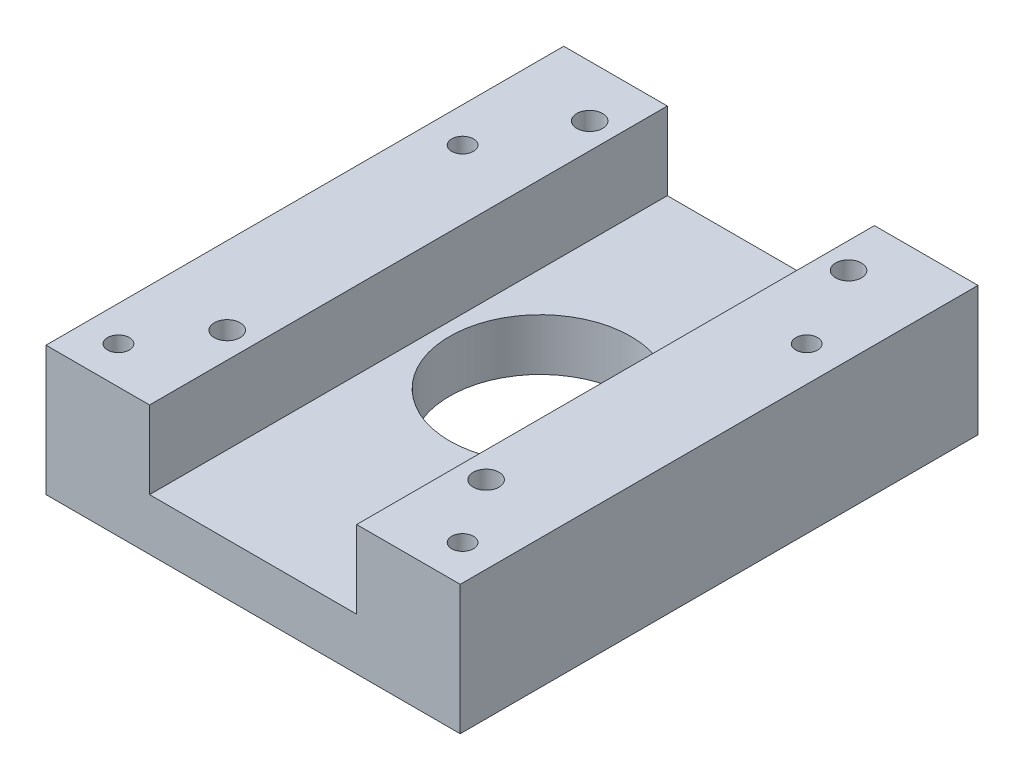
ISO-10303-21;
HEADER;
FILE_DESCRIPTION(('STEP AP214'),'2;1');
FILE_NAME('part.step','',(''),(''),'','','');
FILE_SCHEMA(('AUTOMOTIVE_DESIGN { 1 0 10303 214 1 1 1 1 }'));
ENDSEC;
DATA;
#1=APPLICATION_CONTEXT('core data for automotive mechanical design processes');
#2=APPLICATION_PROTOCOL_DEFINITION('international standard','automotive_design',2000,#1);
#3=PRODUCT_CONTEXT('',#1,'mechanical');
#4=PRODUCT('Part','Part','',(#3));
#5=PRODUCT_RELATED_PRODUCT_CATEGORY('part','',(#4));
#6=PRODUCT_DEFINITION_FORMATION('','',#4);
#7=PRODUCT_DEFINITION_CONTEXT('part definition',#1,'design');
#8=PRODUCT_DEFINITION('design','',#6,#7);
#9=PRODUCT_DEFINITION_SHAPE('','',#8);
#10=(LENGTH_UNIT() NAMED_UNIT(*) SI_UNIT(.MILLI.,.METRE.));
#11=(NAMED_UNIT(*) PLANE_ANGLE_UNIT() SI_UNIT($,.RADIAN.));
#12=(NAMED_UNIT(*) SI_UNIT($,.STERADIAN.) SOLID_ANGLE_UNIT());
#13=UNCERTAINTY_MEASURE_WITH_UNIT(LENGTH_MEASURE(1.E-05),#10,'distance_accuracy_value','');
#14=(GEOMETRIC_REPRESENTATION_CONTEXT(3) GLOBAL_UNCERTAINTY_ASSIGNED_CONTEXT((#13)) GLOBAL_UNIT_ASSIGNED_CONTEXT((#10,
#11,#12)) REPRESENTATION_CONTEXT('',''));
#15=CARTESIAN_POINT('',(0.,0.,0.));
#16=DIRECTION('',(0.,0.,1.));
#17=DIRECTION('',(1.,0.,0.));
#18=AXIS2_PLACEMENT_3D('',#15,#16,#17);
#19=CARTESIAN_POINT('',(0.,0.,80.));
#20=DIRECTION('',(0.,1.,0.));
#21=DIRECTION('',(0.,0.,1.));
#22=AXIS2_PLACEMENT_3D('',#19,#20,#21);
#23=PLANE('',#22);
#24=DIRECTION('',(0.,0.,-1.));
#25=VECTOR('',#24,1.);
#26=CARTESIAN_POINT('',(0.,0.,80.));
#27=LINE('',#26,#25);
#28=CARTESIAN_POINT('',(0.,0.,80.));
#29=VERTEX_POINT('',#28);
#30=CARTESIAN_POINT('',(0.,0.,-20.));
#31=VERTEX_POINT('',#30);
#32=EDGE_CURVE('E11',#29,#31,#27,.T.);
#33=ORIENTED_EDGE('',*,*,#32,.T.);
#34=DIRECTION('',(-1.,0.,0.));
#35=VECTOR('',#34,1.);
#36=CARTESIAN_POINT('',(0.,0.,-20.));
#37=LINE('',#36,#35);
#38=CARTESIAN_POINT('',(80.,0.,-20.));
#39=VERTEX_POINT('',#38);
#40=EDGE_CURVE('E103',#39,#31,#37,.T.);
#41=ORIENTED_EDGE('',*,*,#40,.F.);
#42=DIRECTION('',(0.,0.,-1.));
#43=VECTOR('',#42,1.);
#44=CARTESIAN_POINT('',(80.,0.,80.));
#45=LINE('',#44,#43);
#46=CARTESIAN_POINT('',(80.,0.,80.));
#47=VERTEX_POINT('',#46);
#48=EDGE_CURVE('E43',#47,#39,#45,.T.);
#49=ORIENTED_EDGE('',*,*,#48,.F.);
#50=DIRECTION('',(1.,0.,0.));
#51=VECTOR('',#50,1.);
#52=CARTESIAN_POINT('',(0.,0.,80.));
#53=LINE('',#52,#51);
#54=EDGE_CURVE('E104',#29,#47,#53,.T.);
#55=ORIENTED_EDGE('',*,*,#54,.F.);
#56=EDGE_LOOP('',(#33,#41,#49,#55));
#57=FACE_BOUND('',#56,.T.);
#58=CARTESIAN_POINT('',(73.2340187157678,0.,6.31104689627417));
#59=DIRECTION('',(0.,-1.,0.));
#60=DIRECTION('',(0.,0.,-1.));
#61=AXIS2_PLACEMENT_3D('',#58,#59,#60);
#62=CIRCLE('',#61,2.09999999999999);
#63=CARTESIAN_POINT('',(73.2340187157678,0.,4.21104689627418));
#64=VERTEX_POINT('',#63);
#65=EDGE_CURVE('E123',#64,#64,#62,.T.);
#66=ORIENTED_EDGE('',*,*,#65,.F.);
#67=EDGE_LOOP('',(#66));
#68=FACE_BOUND('',#67,.T.);
#69=CARTESIAN_POINT('',(6.76598128423225,0.,6.31104689627403));
#70=DIRECTION('',(0.,-1.,0.));
#71=DIRECTION('',(0.,0.,-1.));
#72=AXIS2_PLACEMENT_3D('',#69,#70,#71);
#73=CIRCLE('',#72,2.09999999999999);
#74=CARTESIAN_POINT('',(6.76598128423225,0.,4.21104689627405));
#75=VERTEX_POINT('',#74);
#76=EDGE_CURVE('E430',#75,#75,#73,.T.);
#77=ORIENTED_EDGE('',*,*,#76,.F.);
#78=EDGE_LOOP('',(#77));
#79=FACE_BOUND('',#78,.T.);
#80=CARTESIAN_POINT('',(6.76598128423234,0.,72.7790843278096));
#81=DIRECTION('',(0.,-1.,0.));
#82=DIRECTION('',(0.,0.,-1.));
#83=AXIS2_PLACEMENT_3D('',#80,#81,#82);
#84=CIRCLE('',#83,2.09999999999999);
#85=CARTESIAN_POINT('',(6.76598128423234,0.,70.6790843278096));
#86=VERTEX_POINT('',#85);
#87=EDGE_CURVE('E438',#86,#86,#84,.T.);
#88=ORIENTED_EDGE('',*,*,#87,.F.);
#89=EDGE_LOOP('',(#88));
#90=FACE_BOUND('',#89,.T.);
#91=CARTESIAN_POINT('',(73.2340187157679,0.,72.7790843278093));
#92=DIRECTION('',(0.,-1.,0.));
#93=DIRECTION('',(0.,0.,-1.));
#94=AXIS2_PLACEMENT_3D('',#91,#92,#93);
#95=CIRCLE('',#94,2.09999999999999);
#96=CARTESIAN_POINT('',(73.2340187157679,0.,70.6790843278093));
#97=VERTEX_POINT('',#96);
#98=EDGE_CURVE('E444',#97,#97,#95,.T.);
#99=ORIENTED_EDGE('',*,*,#98,.F.);
#100=EDGE_LOOP('',(#99));
#101=FACE_BOUND('',#100,.T.);
#102=CARTESIAN_POINT('',(65.,0.,60.));
#103=DIRECTION('',(0.,1.,0.));
#104=DIRECTION('',(0.,0.,1.));
#105=AXIS2_PLACEMENT_3D('',#102,#103,#104);
#106=CIRCLE('',#105,2.49999999999999);
#107=CARTESIAN_POINT('',(65.,0.,62.5));
#108=VERTEX_POINT('',#107);
#109=EDGE_CURVE('E447',#108,#108,#106,.T.);
#110=ORIENTED_EDGE('',*,*,#109,.T.);
#111=EDGE_LOOP('',(#110));
#112=FACE_BOUND('',#111,.T.);
#113=CARTESIAN_POINT('',(65.,0.,-10.));
#114=DIRECTION('',(0.,1.,0.));
#115=DIRECTION('',(0.,0.,1.));
#116=AXIS2_PLACEMENT_3D('',#113,#114,#115);
#117=CIRCLE('',#116,2.49999999999999);
#118=CARTESIAN_POINT('',(65.,0.,-7.50000000000002));
#119=VERTEX_POINT('',#118);
#120=EDGE_CURVE('E453',#119,#119,#117,.T.);
#121=ORIENTED_EDGE('',*,*,#120,.T.);
#122=EDGE_LOOP('',(#121));
#123=FACE_BOUND('',#122,.T.);
#124=CARTESIAN_POINT('',(15.,0.,60.));
#125=DIRECTION('',(0.,1.,0.));
#126=DIRECTION('',(0.,0.,1.));
#127=AXIS2_PLACEMENT_3D('',#124,#125,#126);
#128=CIRCLE('',#127,2.5);
#129=CARTESIAN_POINT('',(15.,0.,62.5));
#130=VERTEX_POINT('',#129);
#131=EDGE_CURVE('E459',#130,#130,#128,.T.);
#132=ORIENTED_EDGE('',*,*,#131,.T.);
#133=EDGE_LOOP('',(#132));
#134=FACE_BOUND('',#133,.T.);
#135=CARTESIAN_POINT('',(15.,0.,-10.));
#136=DIRECTION('',(0.,1.,0.));
#137=DIRECTION('',(0.,0.,1.));
#138=AXIS2_PLACEMENT_3D('',#135,#136,#137);
#139=CIRCLE('',#138,2.49999999999999);
#140=CARTESIAN_POINT('',(15.,0.,-7.50000000000002));
#141=VERTEX_POINT('',#140);
#142=EDGE_CURVE('E465',#141,#141,#139,.T.);
#143=ORIENTED_EDGE('',*,*,#142,.T.);
#144=EDGE_LOOP('',(#143));
#145=FACE_BOUND('',#144,.T.);
#146=CARTESIAN_POINT('',(39.9999999999998,0.,24.55));
#147=DIRECTION('',(0.,1.,0.));
#148=DIRECTION('',(0.,0.,1.));
#149=AXIS2_PLACEMENT_3D('',#146,#147,#148);
#150=CIRCLE('',#149,17.5);
#151=CARTESIAN_POINT('',(39.9999999999998,0.,7.05000000000003));
#152=VERTEX_POINT('',#151);
#153=EDGE_CURVE('E471',#152,#152,#150,.T.);
#154=ORIENTED_EDGE('',*,*,#153,.T.);
#155=EDGE_LOOP('',(#154));
#156=FACE_BOUND('',#155,.T.);
#157=ADVANCED_FACE('F34',(#57,#68,#79,#90,#101,#112,#123,#134,#145,#156),#23,.F.);
#158=CARTESIAN_POINT('',(60.,10.,80.));
#159=DIRECTION('',(0.,-1.,0.));
#160=DIRECTION('',(0.,0.,-1.));
#161=AXIS2_PLACEMENT_3D('',#158,#159,#160);
#162=PLANE('',#161);
#163=DIRECTION('',(0.,0.,-1.));
#164=VECTOR('',#163,1.);
#165=CARTESIAN_POINT('',(60.,10.,80.));
#166=LINE('',#165,#164);
#167=CARTESIAN_POINT('',(60.,10.,80.));
#168=VERTEX_POINT('',#167);
#169=CARTESIAN_POINT('',(60.,10.,-20.));
#170=VERTEX_POINT('',#169);
#171=EDGE_CURVE('E158',#168,#170,#166,.T.);
#172=ORIENTED_EDGE('',*,*,#171,.T.);
#173=DIRECTION('',(1.,0.,0.));
#174=VECTOR('',#173,1.);
#175=CARTESIAN_POINT('',(60.,10.,-20.));
#176=LINE('',#175,#174);
#177=CARTESIAN_POINT('',(20.,10.,-20.));
#178=VERTEX_POINT('',#177);
#179=EDGE_CURVE('E131',#178,#170,#176,.T.);
#180=ORIENTED_EDGE('',*,*,#179,.F.);
#181=DIRECTION('',(0.,0.,-1.));
#182=VECTOR('',#181,1.);
#183=CARTESIAN_POINT('',(20.,10.,80.));
#184=LINE('',#183,#182);
#185=CARTESIAN_POINT('',(20.,10.,80.));
#186=VERTEX_POINT('',#185);
#187=EDGE_CURVE('E156',#186,#178,#184,.T.);
#188=ORIENTED_EDGE('',*,*,#187,.F.);
#189=DIRECTION('',(-1.,0.,0.));
#190=VECTOR('',#189,1.);
#191=CARTESIAN_POINT('',(60.,10.,80.));
#192=LINE('',#191,#190);
#193=EDGE_CURVE('E149',#168,#186,#192,.T.);
#194=ORIENTED_EDGE('',*,*,#193,.F.);
#195=EDGE_LOOP('',(#172,#180,#188,#194));
#196=FACE_BOUND('',#195,.T.);
#197=CARTESIAN_POINT('',(39.9999999999998,10.,24.55));
#198=DIRECTION('',(0.,-1.,0.));
#199=DIRECTION('',(0.,0.,-1.));
#200=AXIS2_PLACEMENT_3D('',#197,#198,#199);
#201=CIRCLE('',#200,17.5);
#202=CARTESIAN_POINT('',(39.9999999999998,10.,7.05000000000003));
#203=VERTEX_POINT('',#202);
#204=EDGE_CURVE('E38',#203,#203,#201,.F.);
#205=ORIENTED_EDGE('',*,*,#204,.F.);
#206=EDGE_LOOP('',(#205));
#207=FACE_BOUND('',#206,.T.);
#208=ADVANCED_FACE('F183',(#196,#207),#162,.F.);
#209=CARTESIAN_POINT('',(0.,25.,80.));
#210=DIRECTION('',(1.,0.,0.));
#211=DIRECTION('',(0.,0.,-1.));
#212=AXIS2_PLACEMENT_3D('',#209,#210,#211);
#213=PLANE('',#212);
#214=DIRECTION('',(0.,0.,-1.));
#215=VECTOR('',#214,1.);
#216=CARTESIAN_POINT('',(0.,25.,80.));
#217=LINE('',#216,#215);
#218=CARTESIAN_POINT('',(0.,25.,80.));
#219=VERTEX_POINT('',#218);
#220=CARTESIAN_POINT('',(0.,25.,-20.));
#221=VERTEX_POINT('',#220);
#222=EDGE_CURVE('E109',#219,#221,#217,.T.);
#223=ORIENTED_EDGE('',*,*,#222,.T.);
#224=DIRECTION('',(0.,1.,0.));
#225=VECTOR('',#224,1.);
#226=CARTESIAN_POINT('',(0.,25.,-20.));
#227=LINE('',#226,#225);
#228=EDGE_CURVE('E108',#31,#221,#227,.T.);
#229=ORIENTED_EDGE('',*,*,#228,.F.);
#230=ORIENTED_EDGE('',*,*,#32,.F.);
#231=DIRECTION('',(0.,-1.,0.));
#232=VECTOR('',#231,1.);
#233=CARTESIAN_POINT('',(0.,25.,80.));
#234=LINE('',#233,#232);
#235=EDGE_CURVE('E140',#219,#29,#234,.T.);
#236=ORIENTED_EDGE('',*,*,#235,.F.);
#237=EDGE_LOOP('',(#223,#229,#230,#236));
#238=FACE_BOUND('',#237,.T.);
#239=ADVANCED_FACE('F36',(#238),#213,.F.);
#240=CARTESIAN_POINT('',(80.,0.,80.));
#241=DIRECTION('',(-1.,0.,0.));
#242=DIRECTION('',(0.,0.,1.));
#243=AXIS2_PLACEMENT_3D('',#240,#241,#242);
#244=PLANE('',#243);
#245=ORIENTED_EDGE('',*,*,#48,.T.);
#246=DIRECTION('',(0.,-1.,0.));
#247=VECTOR('',#246,1.);
#248=CARTESIAN_POINT('',(80.,0.,-20.));
#249=LINE('',#248,#247);
#250=CARTESIAN_POINT('',(80.,25.,-20.));
#251=VERTEX_POINT('',#250);
#252=EDGE_CURVE('E119',#251,#39,#249,.T.);
#253=ORIENTED_EDGE('',*,*,#252,.F.);
#254=DIRECTION('',(0.,0.,-1.));
#255=VECTOR('',#254,1.);
#256=CARTESIAN_POINT('',(80.,25.,80.));
#257=LINE('',#256,#255);
#258=CARTESIAN_POINT('',(80.,25.,80.));
#259=VERTEX_POINT('',#258);
#260=EDGE_CURVE('E162',#259,#251,#257,.T.);
#261=ORIENTED_EDGE('',*,*,#260,.F.);
#262=DIRECTION('',(0.,1.,0.));
#263=VECTOR('',#262,1.);
#264=CARTESIAN_POINT('',(80.,0.,80.));
#265=LINE('',#264,#263);
#266=EDGE_CURVE('E143',#47,#259,#265,.T.);
#267=ORIENTED_EDGE('',*,*,#266,.F.);
#268=EDGE_LOOP('',(#245,#253,#261,#267));
#269=FACE_BOUND('',#268,.T.);
#270=ADVANCED_FACE('F166',(#269),#244,.F.);
#271=CARTESIAN_POINT('',(80.,25.,80.));
#272=DIRECTION('',(0.,-1.,0.));
#273=DIRECTION('',(0.,0.,-1.));
#274=AXIS2_PLACEMENT_3D('',#271,#272,#273);
#275=PLANE('',#274);
#276=CARTESIAN_POINT('',(65.,25.,-10.));
#277=DIRECTION('',(0.,1.,0.));
#278=DIRECTION('',(0.,0.,1.));
#279=AXIS2_PLACEMENT_3D('',#276,#277,#278);
#280=CIRCLE('',#279,2.49999999999999);
#281=CARTESIAN_POINT('',(65.,25.,-7.50000000000002));
#282=VERTEX_POINT('',#281);
#283=EDGE_CURVE('E456',#282,#282,#280,.T.);
#284=ORIENTED_EDGE('',*,*,#283,.F.);
#285=EDGE_LOOP('',(#284));
#286=FACE_BOUND('',#285,.T.);
#287=CARTESIAN_POINT('',(65.,25.,60.));
#288=DIRECTION('',(0.,1.,0.));
#289=DIRECTION('',(0.,0.,1.));
#290=AXIS2_PLACEMENT_3D('',#287,#288,#289);
#291=CIRCLE('',#290,2.49999999999999);
#292=CARTESIAN_POINT('',(65.,25.,62.5));
#293=VERTEX_POINT('',#292);
#294=EDGE_CURVE('E450',#293,#293,#291,.T.);
#295=ORIENTED_EDGE('',*,*,#294,.F.);
#296=EDGE_LOOP('',(#295));
#297=FACE_BOUND('',#296,.T.);
#298=CARTESIAN_POINT('',(73.2340187157679,25.,72.7790843278093));
#299=DIRECTION('',(0.,-1.,0.));
#300=DIRECTION('',(0.,0.,-1.));
#301=AXIS2_PLACEMENT_3D('',#298,#299,#300);
#302=CIRCLE('',#301,2.09999999999999);
#303=CARTESIAN_POINT('',(73.2340187157679,25.,70.6790843278093));
#304=VERTEX_POINT('',#303);
#305=EDGE_CURVE('E441',#304,#304,#302,.T.);
#306=ORIENTED_EDGE('',*,*,#305,.T.);
#307=EDGE_LOOP('',(#306));
#308=FACE_BOUND('',#307,.T.);
#309=CARTESIAN_POINT('',(73.2340187157678,25.,6.31104689627417));
#310=DIRECTION('',(0.,-1.,0.));
#311=DIRECTION('',(0.,0.,-1.));
#312=AXIS2_PLACEMENT_3D('',#309,#310,#311);
#313=CIRCLE('',#312,2.09999999999999);
#314=CARTESIAN_POINT('',(73.2340187157678,25.,4.21104689627418));
#315=VERTEX_POINT('',#314);
#316=EDGE_CURVE('E120',#315,#315,#313,.T.);
#317=ORIENTED_EDGE('',*,*,#316,.T.);
#318=EDGE_LOOP('',(#317));
#319=FACE_BOUND('',#318,.T.);
#320=ORIENTED_EDGE('',*,*,#260,.T.);
#321=DIRECTION('',(1.,0.,0.));
#322=VECTOR('',#321,1.);
#323=CARTESIAN_POINT('',(80.,25.,-20.));
#324=LINE('',#323,#322);
#325=CARTESIAN_POINT('',(60.,25.,-20.));
#326=VERTEX_POINT('',#325);
#327=EDGE_CURVE('E137',#326,#251,#324,.T.);
#328=ORIENTED_EDGE('',*,*,#327,.F.);
#329=DIRECTION('',(0.,0.,-1.));
#330=VECTOR('',#329,1.);
#331=CARTESIAN_POINT('',(60.,25.,80.));
#332=LINE('',#331,#330);
#333=CARTESIAN_POINT('',(60.,25.,80.));
#334=VERTEX_POINT('',#333);
#335=EDGE_CURVE('E160',#334,#326,#332,.T.);
#336=ORIENTED_EDGE('',*,*,#335,.F.);
#337=DIRECTION('',(-1.,0.,0.));
#338=VECTOR('',#337,1.);
#339=CARTESIAN_POINT('',(80.,25.,80.));
#340=LINE('',#339,#338);
#341=EDGE_CURVE('E145',#259,#334,#340,.T.);
#342=ORIENTED_EDGE('',*,*,#341,.F.);
#343=EDGE_LOOP('',(#320,#328,#336,#342));
#344=FACE_BOUND('',#343,.T.);
#345=ADVANCED_FACE('F175',(#286,#297,#308,#319,#344),#275,.F.);
#346=CARTESIAN_POINT('',(60.,25.,80.));
#347=DIRECTION('',(1.,0.,0.));
#348=DIRECTION('',(0.,1.,0.));
#349=AXIS2_PLACEMENT_3D('',#346,#347,#348);
#350=PLANE('',#349);
#351=ORIENTED_EDGE('',*,*,#335,.T.);
#352=DIRECTION('',(0.,1.,0.));
#353=VECTOR('',#352,1.);
#354=CARTESIAN_POINT('',(60.,25.,-20.));
#355=LINE('',#354,#353);
#356=EDGE_CURVE('E134',#170,#326,#355,.T.);
#357=ORIENTED_EDGE('',*,*,#356,.F.);
#358=ORIENTED_EDGE('',*,*,#171,.F.);
#359=DIRECTION('',(0.,-1.,0.));
#360=VECTOR('',#359,1.);
#361=CARTESIAN_POINT('',(60.,25.,80.));
#362=LINE('',#361,#360);
#363=EDGE_CURVE('E147',#334,#168,#362,.T.);
#364=ORIENTED_EDGE('',*,*,#363,.F.);
#365=EDGE_LOOP('',(#351,#357,#358,#364));
#366=FACE_BOUND('',#365,.T.);
#367=ADVANCED_FACE('F178',(#366),#350,.F.);
#368=CARTESIAN_POINT('',(20.,10.,80.));
#369=DIRECTION('',(-1.,0.,0.));
#370=DIRECTION('',(0.,-1.,0.));
#371=AXIS2_PLACEMENT_3D('',#368,#369,#370);
#372=PLANE('',#371);
#373=ORIENTED_EDGE('',*,*,#187,.T.);
#374=DIRECTION('',(0.,-1.,0.));
#375=VECTOR('',#374,1.);
#376=CARTESIAN_POINT('',(20.,10.,-20.));
#377=LINE('',#376,#375);
#378=CARTESIAN_POINT('',(20.,25.,-20.));
#379=VERTEX_POINT('',#378);
#380=EDGE_CURVE('E128',#379,#178,#377,.T.);
#381=ORIENTED_EDGE('',*,*,#380,.F.);
#382=DIRECTION('',(0.,0.,-1.));
#383=VECTOR('',#382,1.);
#384=CARTESIAN_POINT('',(20.,25.,80.));
#385=LINE('',#384,#383);
#386=CARTESIAN_POINT('',(20.,25.,80.));
#387=VERTEX_POINT('',#386);
#388=EDGE_CURVE('E154',#387,#379,#385,.T.);
#389=ORIENTED_EDGE('',*,*,#388,.F.);
#390=DIRECTION('',(0.,1.,0.));
#391=VECTOR('',#390,1.);
#392=CARTESIAN_POINT('',(20.,10.,80.));
#393=LINE('',#392,#391);
#394=EDGE_CURVE('E55',#186,#387,#393,.T.);
#395=ORIENTED_EDGE('',*,*,#394,.F.);
#396=EDGE_LOOP('',(#373,#381,#389,#395));
#397=FACE_BOUND('',#396,.T.);
#398=ADVANCED_FACE('F187',(#397),#372,.F.);
#399=CARTESIAN_POINT('',(20.,25.,80.));
#400=DIRECTION('',(0.,-1.,0.));
#401=DIRECTION('',(0.,0.,-1.));
#402=AXIS2_PLACEMENT_3D('',#399,#400,#401);
#403=PLANE('',#402);
#404=CARTESIAN_POINT('',(15.,25.,-10.));
#405=DIRECTION('',(0.,1.,0.));
#406=DIRECTION('',(0.,0.,1.));
#407=AXIS2_PLACEMENT_3D('',#404,#405,#406);
#408=CIRCLE('',#407,2.49999999999999);
#409=CARTESIAN_POINT('',(15.,25.,-7.50000000000002));
#410=VERTEX_POINT('',#409);
#411=EDGE_CURVE('E468',#410,#410,#408,.T.);
#412=ORIENTED_EDGE('',*,*,#411,.F.);
#413=EDGE_LOOP('',(#412));
#414=FACE_BOUND('',#413,.T.);
#415=CARTESIAN_POINT('',(15.,25.,60.));
#416=DIRECTION('',(0.,1.,0.));
#417=DIRECTION('',(0.,0.,1.));
#418=AXIS2_PLACEMENT_3D('',#415,#416,#417);
#419=CIRCLE('',#418,2.49999999999999);
#420=CARTESIAN_POINT('',(15.,25.,62.5));
#421=VERTEX_POINT('',#420);
#422=EDGE_CURVE('E462',#421,#421,#419,.T.);
#423=ORIENTED_EDGE('',*,*,#422,.F.);
#424=EDGE_LOOP('',(#423));
#425=FACE_BOUND('',#424,.T.);
#426=CARTESIAN_POINT('',(6.76598128423234,25.,72.7790843278096));
#427=DIRECTION('',(0.,-1.,0.));
#428=DIRECTION('',(0.,0.,-1.));
#429=AXIS2_PLACEMENT_3D('',#426,#427,#428);
#430=CIRCLE('',#429,2.09999999999999);
#431=CARTESIAN_POINT('',(6.76598128423234,25.,70.6790843278096));
#432=VERTEX_POINT('',#431);
#433=EDGE_CURVE('E435',#432,#432,#430,.T.);
#434=ORIENTED_EDGE('',*,*,#433,.T.);
#435=EDGE_LOOP('',(#434));
#436=FACE_BOUND('',#435,.T.);
#437=CARTESIAN_POINT('',(6.76598128423225,25.,6.31104689627403));
#438=DIRECTION('',(0.,-1.,0.));
#439=DIRECTION('',(0.,0.,-1.));
#440=AXIS2_PLACEMENT_3D('',#437,#438,#439);
#441=CIRCLE('',#440,2.09999999999999);
#442=CARTESIAN_POINT('',(6.76598128423225,25.,4.21104689627404));
#443=VERTEX_POINT('',#442);
#444=EDGE_CURVE('E428',#443,#443,#441,.T.);
#445=ORIENTED_EDGE('',*,*,#444,.T.);
#446=EDGE_LOOP('',(#445));
#447=FACE_BOUND('',#446,.T.);
#448=ORIENTED_EDGE('',*,*,#388,.T.);
#449=DIRECTION('',(1.,0.,0.));
#450=VECTOR('',#449,1.);
#451=CARTESIAN_POINT('',(20.,25.,-20.));
#452=LINE('',#451,#450);
#453=EDGE_CURVE('E113',#221,#379,#452,.T.);
#454=ORIENTED_EDGE('',*,*,#453,.F.);
#455=ORIENTED_EDGE('',*,*,#222,.F.);
#456=DIRECTION('',(-1.,0.,0.));
#457=VECTOR('',#456,1.);
#458=CARTESIAN_POINT('',(20.,25.,80.));
#459=LINE('',#458,#457);
#460=EDGE_CURVE('E50',#387,#219,#459,.T.);
#461=ORIENTED_EDGE('',*,*,#460,.F.);
#462=EDGE_LOOP('',(#448,#454,#455,#461));
#463=FACE_BOUND('',#462,.T.);
#464=ADVANCED_FACE('F189',(#414,#425,#436,#447,#463),#403,.F.);
#465=CARTESIAN_POINT('',(0.,0.,80.));
#466=DIRECTION('',(0.,0.,1.));
#467=DIRECTION('',(1.,0.,0.));
#468=AXIS2_PLACEMENT_3D('',#465,#466,#467);
#469=PLANE('',#468);
#470=ORIENTED_EDGE('',*,*,#235,.T.);
#471=ORIENTED_EDGE('',*,*,#54,.T.);
#472=ORIENTED_EDGE('',*,*,#266,.T.);
#473=ORIENTED_EDGE('',*,*,#341,.T.);
#474=ORIENTED_EDGE('',*,*,#363,.T.);
#475=ORIENTED_EDGE('',*,*,#193,.T.);
#476=ORIENTED_EDGE('',*,*,#394,.T.);
#477=ORIENTED_EDGE('',*,*,#460,.T.);
#478=EDGE_LOOP('',(#470,#471,#472,#473,#474,#475,#476,#477));
#479=FACE_BOUND('',#478,.T.);
#480=ADVANCED_FACE('F169',(#479),#469,.T.);
#481=CARTESIAN_POINT('',(80.,0.,-20.));
#482=DIRECTION('',(0.,0.,1.));
#483=DIRECTION('',(1.,0.,0.));
#484=AXIS2_PLACEMENT_3D('',#481,#482,#483);
#485=PLANE('',#484);
#486=ORIENTED_EDGE('',*,*,#40,.T.);
#487=ORIENTED_EDGE('',*,*,#228,.T.);
#488=ORIENTED_EDGE('',*,*,#453,.T.);
#489=ORIENTED_EDGE('',*,*,#380,.T.);
#490=ORIENTED_EDGE('',*,*,#179,.T.);
#491=ORIENTED_EDGE('',*,*,#356,.T.);
#492=ORIENTED_EDGE('',*,*,#327,.T.);
#493=ORIENTED_EDGE('',*,*,#252,.T.);
#494=EDGE_LOOP('',(#486,#487,#488,#489,#490,#491,#492,#493));
#495=FACE_BOUND('',#494,.T.);
#496=ADVANCED_FACE('F116',(#495),#485,.F.);
#497=CARTESIAN_POINT('',(73.2340187157678,0.,6.31104689627417));
#498=DIRECTION('',(0.,-1.,0.));
#499=DIRECTION('',(0.,0.,-1.));
#500=AXIS2_PLACEMENT_3D('',#497,#498,#499);
#501=CYLINDRICAL_SURFACE('',#500,2.09999999999999);
#502=ORIENTED_EDGE('',*,*,#316,.F.);
#503=EDGE_LOOP('',(#502));
#504=FACE_BOUND('',#503,.T.);
#505=ORIENTED_EDGE('',*,*,#65,.T.);
#506=EDGE_LOOP('',(#505));
#507=FACE_BOUND('',#506,.T.);
#508=ADVANCED_FACE('F243',(#504,#507),#501,.F.);
#509=CARTESIAN_POINT('',(6.76598128423225,0.,6.31104689627403));
#510=DIRECTION('',(0.,-1.,0.));
#511=DIRECTION('',(0.,0.,-1.));
#512=AXIS2_PLACEMENT_3D('',#509,#510,#511);
#513=CYLINDRICAL_SURFACE('',#512,2.09999999999999);
#514=ORIENTED_EDGE('',*,*,#444,.F.);
#515=EDGE_LOOP('',(#514));
#516=FACE_BOUND('',#515,.T.);
#517=ORIENTED_EDGE('',*,*,#76,.T.);
#518=EDGE_LOOP('',(#517));
#519=FACE_BOUND('',#518,.T.);
#520=ADVANCED_FACE('F304',(#516,#519),#513,.F.);
#521=CARTESIAN_POINT('',(6.76598128423234,0.,72.7790843278096));
#522=DIRECTION('',(0.,-1.,0.));
#523=DIRECTION('',(0.,0.,-1.));
#524=AXIS2_PLACEMENT_3D('',#521,#522,#523);
#525=CYLINDRICAL_SURFACE('',#524,2.09999999999999);
#526=ORIENTED_EDGE('',*,*,#433,.F.);
#527=EDGE_LOOP('',(#526));
#528=FACE_BOUND('',#527,.T.);
#529=ORIENTED_EDGE('',*,*,#87,.T.);
#530=EDGE_LOOP('',(#529));
#531=FACE_BOUND('',#530,.T.);
#532=ADVANCED_FACE('F296',(#528,#531),#525,.F.);
#533=CARTESIAN_POINT('',(73.2340187157679,0.,72.7790843278093));
#534=DIRECTION('',(0.,-1.,0.));
#535=DIRECTION('',(0.,0.,-1.));
#536=AXIS2_PLACEMENT_3D('',#533,#534,#535);
#537=CYLINDRICAL_SURFACE('',#536,2.09999999999999);
#538=ORIENTED_EDGE('',*,*,#305,.F.);
#539=EDGE_LOOP('',(#538));
#540=FACE_BOUND('',#539,.T.);
#541=ORIENTED_EDGE('',*,*,#98,.T.);
#542=EDGE_LOOP('',(#541));
#543=FACE_BOUND('',#542,.T.);
#544=ADVANCED_FACE('F289',(#540,#543),#537,.F.);
#545=CARTESIAN_POINT('',(65.,25.,60.));
#546=DIRECTION('',(0.,1.,0.));
#547=DIRECTION('',(0.,0.,1.));
#548=AXIS2_PLACEMENT_3D('',#545,#546,#547);
#549=CYLINDRICAL_SURFACE('',#548,2.49999999999999);
#550=ORIENTED_EDGE('',*,*,#109,.F.);
#551=EDGE_LOOP('',(#550));
#552=FACE_BOUND('',#551,.T.);
#553=ORIENTED_EDGE('',*,*,#294,.T.);
#554=EDGE_LOOP('',(#553));
#555=FACE_BOUND('',#554,.T.);
#556=ADVANCED_FACE('F281',(#552,#555),#549,.F.);
#557=CARTESIAN_POINT('',(65.,25.,-10.));
#558=DIRECTION('',(0.,1.,0.));
#559=DIRECTION('',(0.,0.,1.));
#560=AXIS2_PLACEMENT_3D('',#557,#558,#559);
#561=CYLINDRICAL_SURFACE('',#560,2.49999999999999);
#562=ORIENTED_EDGE('',*,*,#120,.F.);
#563=EDGE_LOOP('',(#562));
#564=FACE_BOUND('',#563,.T.);
#565=ORIENTED_EDGE('',*,*,#283,.T.);
#566=EDGE_LOOP('',(#565));
#567=FACE_BOUND('',#566,.T.);
#568=ADVANCED_FACE('F273',(#564,#567),#561,.F.);
#569=CARTESIAN_POINT('',(15.,25.,60.));
#570=DIRECTION('',(0.,1.,0.));
#571=DIRECTION('',(0.,0.,1.));
#572=AXIS2_PLACEMENT_3D('',#569,#570,#571);
#573=CYLINDRICAL_SURFACE('',#572,2.49999999999999);
#574=ORIENTED_EDGE('',*,*,#131,.F.);
#575=EDGE_LOOP('',(#574));
#576=FACE_BOUND('',#575,.T.);
#577=ORIENTED_EDGE('',*,*,#422,.T.);
#578=EDGE_LOOP('',(#577));
#579=FACE_BOUND('',#578,.T.);
#580=ADVANCED_FACE('F265',(#576,#579),#573,.F.);
#581=CARTESIAN_POINT('',(15.,25.,-10.));
#582=DIRECTION('',(0.,1.,0.));
#583=DIRECTION('',(0.,0.,1.));
#584=AXIS2_PLACEMENT_3D('',#581,#582,#583);
#585=CYLINDRICAL_SURFACE('',#584,2.49999999999999);
#586=ORIENTED_EDGE('',*,*,#142,.F.);
#587=EDGE_LOOP('',(#586));
#588=FACE_BOUND('',#587,.T.);
#589=ORIENTED_EDGE('',*,*,#411,.T.);
#590=EDGE_LOOP('',(#589));
#591=FACE_BOUND('',#590,.T.);
#592=ADVANCED_FACE('F254',(#588,#591),#585,.F.);
#593=CARTESIAN_POINT('',(39.9999999999998,25.,24.55));
#594=DIRECTION('',(0.,-1.,0.));
#595=DIRECTION('',(0.,0.,-1.));
#596=AXIS2_PLACEMENT_3D('',#593,#594,#595);
#597=CYLINDRICAL_SURFACE('',#596,17.5);
#598=CARTESIAN_POINT('',(39.9999999999998,0.,7.05000000000003));
#599=CARTESIAN_POINT('',(39.9999999999998,0.104166666666667,7.05000000000003));
#600=CARTESIAN_POINT('',(39.9999999999998,0.208333333333334,7.05000000000003));
#601=CARTESIAN_POINT('',(39.9999999999998,0.416666666666667,7.05000000000003));
#602=CARTESIAN_POINT('',(39.9999999999998,0.520833333333334,7.05000000000003));
#603=CARTESIAN_POINT('',(39.9999999999998,0.729166666666667,7.05000000000003));
#604=CARTESIAN_POINT('',(39.9999999999998,0.833333333333334,7.05000000000003));
#605=CARTESIAN_POINT('',(39.9999999999998,1.04166666666667,7.05000000000003));
#606=CARTESIAN_POINT('',(39.9999999999998,1.14583333333333,7.05000000000003));
#607=CARTESIAN_POINT('',(39.9999999999998,1.35416666666667,7.05000000000003));
#608=CARTESIAN_POINT('',(39.9999999999998,1.45833333333333,7.05000000000003));
#609=CARTESIAN_POINT('',(39.9999999999998,1.66666666666667,7.05000000000003));
#610=CARTESIAN_POINT('',(39.9999999999998,1.77083333333334,7.05000000000003));
#611=CARTESIAN_POINT('',(39.9999999999998,1.97916666666667,7.05000000000003));
#612=CARTESIAN_POINT('',(39.9999999999998,2.08333333333334,7.05000000000003));
#613=CARTESIAN_POINT('',(39.9999999999998,2.29166666666667,7.05000000000003));
#614=CARTESIAN_POINT('',(39.9999999999998,2.39583333333334,7.05000000000003));
#615=CARTESIAN_POINT('',(39.9999999999998,2.60416666666667,7.05000000000003));
#616=CARTESIAN_POINT('',(39.9999999999998,2.70833333333334,7.05000000000003));
#617=CARTESIAN_POINT('',(39.9999999999998,2.91666666666667,7.05000000000003));
#618=CARTESIAN_POINT('',(39.9999999999998,3.02083333333334,7.05000000000003));
#619=CARTESIAN_POINT('',(39.9999999999998,3.22916666666667,7.05000000000003));
#620=CARTESIAN_POINT('',(39.9999999999998,3.33333333333334,7.05000000000003));
#621=CARTESIAN_POINT('',(39.9999999999998,3.54166666666667,7.05000000000003));
#622=CARTESIAN_POINT('',(39.9999999999998,3.64583333333334,7.05000000000003));
#623=CARTESIAN_POINT('',(39.9999999999998,3.85416666666667,7.05000000000003));
#624=CARTESIAN_POINT('',(39.9999999999998,3.95833333333334,7.05000000000003));
#625=CARTESIAN_POINT('',(39.9999999999998,4.16666666666667,7.05000000000003));
#626=CARTESIAN_POINT('',(39.9999999999998,4.27083333333334,7.05000000000003));
#627=CARTESIAN_POINT('',(39.9999999999998,4.47916666666667,7.05000000000003));
#628=CARTESIAN_POINT('',(39.9999999999998,4.58333333333334,7.05000000000003));
#629=CARTESIAN_POINT('',(39.9999999999998,4.79166666666667,7.05000000000003));
#630=CARTESIAN_POINT('',(39.9999999999998,4.89583333333334,7.05000000000003));
#631=CARTESIAN_POINT('',(39.9999999999998,5.10416666666667,7.05000000000003));
#632=CARTESIAN_POINT('',(39.9999999999998,5.20833333333334,7.05000000000003));
#633=CARTESIAN_POINT('',(39.9999999999998,5.41666666666667,7.05000000000003));
#634=CARTESIAN_POINT('',(39.9999999999998,5.52083333333334,7.05000000000003));
#635=CARTESIAN_POINT('',(39.9999999999998,5.72916666666667,7.05000000000003));
#636=CARTESIAN_POINT('',(39.9999999999998,5.83333333333334,7.05000000000003));
#637=CARTESIAN_POINT('',(39.9999999999998,6.04166666666667,7.05000000000003));
#638=CARTESIAN_POINT('',(39.9999999999998,6.14583333333334,7.05000000000003));
#639=CARTESIAN_POINT('',(39.9999999999998,6.35416666666667,7.05000000000003));
#640=CARTESIAN_POINT('',(39.9999999999998,6.45833333333334,7.05000000000003));
#641=CARTESIAN_POINT('',(39.9999999999998,6.66666666666667,7.05000000000003));
#642=CARTESIAN_POINT('',(39.9999999999998,6.77083333333334,7.05000000000003));
#643=CARTESIAN_POINT('',(39.9999999999998,6.97916666666667,7.05000000000003));
#644=CARTESIAN_POINT('',(39.9999999999998,7.08333333333334,7.05000000000003));
#645=CARTESIAN_POINT('',(39.9999999999998,7.29166666666667,7.05000000000003));
#646=CARTESIAN_POINT('',(39.9999999999998,7.39583333333334,7.05000000000003));
#647=CARTESIAN_POINT('',(39.9999999999998,7.60416666666667,7.05000000000003));
#648=CARTESIAN_POINT('',(39.9999999999998,7.70833333333334,7.05000000000003));
#649=CARTESIAN_POINT('',(39.9999999999998,7.91666666666667,7.05000000000003));
#650=CARTESIAN_POINT('',(39.9999999999998,8.02083333333334,7.05000000000003));
#651=CARTESIAN_POINT('',(39.9999999999998,8.22916666666667,7.05000000000003));
#652=CARTESIAN_POINT('',(39.9999999999998,8.33333333333334,7.05000000000003));
#653=CARTESIAN_POINT('',(39.9999999999998,8.54166666666667,7.05000000000003));
#654=CARTESIAN_POINT('',(39.9999999999998,8.64583333333334,7.05000000000003));
#655=CARTESIAN_POINT('',(39.9999999999998,8.85416666666667,7.05000000000003));
#656=CARTESIAN_POINT('',(39.9999999999998,8.95833333333334,7.05000000000003));
#657=CARTESIAN_POINT('',(39.9999999999998,9.16666666666667,7.05000000000003));
#658=CARTESIAN_POINT('',(39.9999999999998,9.27083333333334,7.05000000000003));
#659=CARTESIAN_POINT('',(39.9999999999998,9.47916666666667,7.05000000000003));
#660=CARTESIAN_POINT('',(39.9999999999998,9.58333333333334,7.05000000000003));
#661=CARTESIAN_POINT('',(39.9999999999998,9.79166666666667,7.05000000000003));
#662=CARTESIAN_POINT('',(39.9999999999998,9.89583333333334,7.05000000000003));
#663=CARTESIAN_POINT('',(39.9999999999998,10.,7.05000000000003));
#664=B_SPLINE_CURVE_WITH_KNOTS('',3,(#598,#599,#600,#601,#602,#603,#604,#605,#606,#607,#608,
#609,#610,#611,#612,#613,#614,#615,#616,#617,#618,#619,#620,#621,#622,#623,#624,#625,#626,#627,
#628,#629,#630,#631,#632,#633,#634,#635,#636,#637,#638,#639,#640,#641,#642,#643,#644,#645,#646,
#647,#648,#649,#650,#651,#652,#653,#654,#655,#656,#657,#658,#659,#660,#661,#662,#663),
.UNSPECIFIED.,.F.,.F.,(4,2,2,2,2,2,2,2,2,2,2,2,2,2,2,2,2,2,2,2,2,2,2,2,2,2,2,2,2,2,2,2,4),(0.,
0.3125,0.625000000000001,0.937500000000001,1.25,1.5625,1.875,2.1875,2.5,2.8125,3.125,3.4375,
3.75,4.0625,4.375,4.6875,5.,5.3125,5.62500000000001,5.93750000000001,6.25000000000001,6.5625,
6.875,7.1875,7.5,7.8125,8.125,8.4375,8.75,9.06250000000001,9.37500000000001,9.6875,10.),.UNSPECIFIED.);
#665=EDGE_CURVE('BSEAM250',#152,#203,#664,.T.);
#666=ORIENTED_EDGE('',*,*,#153,.F.);
#667=ORIENTED_EDGE('',*,*,#204,.T.);
#668=ORIENTED_EDGE('',*,*,#665,.T.);
#669=ORIENTED_EDGE('',*,*,#665,.F.);
#670=EDGE_LOOP('',(#666,#668,#667,#669));
#671=FACE_BOUND('',#670,.T.);
#672=ADVANCED_FACE('F250',(#671),#597,.F.);
#673=CLOSED_SHELL('',(#157,#208,#239,#270,#345,#367,#398,#464,#480,#496,#508,#520,#532,#544,
#556,#568,#580,#592,#672));
#674=MANIFOLD_SOLID_BREP('B2',#673);
#675=ADVANCED_BREP_SHAPE_REPRESENTATION('',(#18,#674),#14);
#676=SHAPE_DEFINITION_REPRESENTATION(#9,#675);
ENDSEC;
END-ISO-10303-21;
